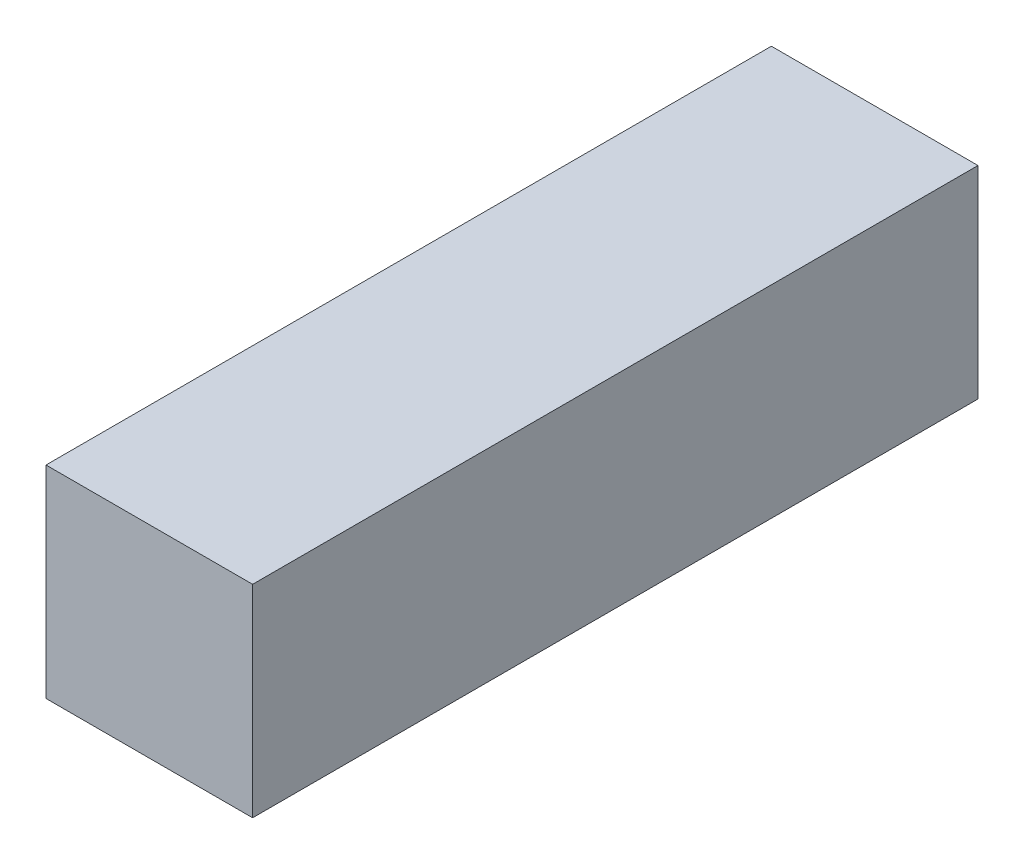
ISO-10303-21;
HEADER;
FILE_DESCRIPTION(('STEP AP214'),'2;1');
FILE_NAME('part.step','',(''),(''),'','','');
FILE_SCHEMA(('AUTOMOTIVE_DESIGN { 1 0 10303 214 1 1 1 1 }'));
ENDSEC;
DATA;
#1=APPLICATION_CONTEXT('core data for automotive mechanical design processes');
#2=APPLICATION_PROTOCOL_DEFINITION('international standard','automotive_design',2000,#1);
#3=PRODUCT_CONTEXT('',#1,'mechanical');
#4=PRODUCT('Part','Part','',(#3));
#5=PRODUCT_RELATED_PRODUCT_CATEGORY('part','',(#4));
#6=PRODUCT_DEFINITION_FORMATION('','',#4);
#7=PRODUCT_DEFINITION_CONTEXT('part definition',#1,'design');
#8=PRODUCT_DEFINITION('design','',#6,#7);
#9=PRODUCT_DEFINITION_SHAPE('','',#8);
#10=(LENGTH_UNIT() NAMED_UNIT(*) SI_UNIT(.MILLI.,.METRE.));
#11=(NAMED_UNIT(*) PLANE_ANGLE_UNIT() SI_UNIT($,.RADIAN.));
#12=(NAMED_UNIT(*) SI_UNIT($,.STERADIAN.) SOLID_ANGLE_UNIT());
#13=UNCERTAINTY_MEASURE_WITH_UNIT(LENGTH_MEASURE(1.E-05),#10,'distance_accuracy_value','');
#14=(GEOMETRIC_REPRESENTATION_CONTEXT(3) GLOBAL_UNCERTAINTY_ASSIGNED_CONTEXT((#13)) GLOBAL_UNIT_ASSIGNED_CONTEXT((#10,
#11,#12)) REPRESENTATION_CONTEXT('',''));
#15=CARTESIAN_POINT('',(0.,0.,0.));
#16=DIRECTION('',(0.,0.,1.));
#17=DIRECTION('',(1.,0.,0.));
#18=AXIS2_PLACEMENT_3D('',#15,#16,#17);
#19=CARTESIAN_POINT('',(23.5,46.,82.5));
#20=DIRECTION('',(-1.,0.,0.));
#21=DIRECTION('',(0.,0.,1.));
#22=AXIS2_PLACEMENT_3D('',#19,#20,#21);
#23=PLANE('',#22);
#24=DIRECTION('',(0.,0.,-1.));
#25=VECTOR('',#24,1.);
#26=CARTESIAN_POINT('',(23.5,0.,82.5));
#27=LINE('',#26,#25);
#28=CARTESIAN_POINT('',(23.5,0.,82.5));
#29=VERTEX_POINT('',#28);
#30=CARTESIAN_POINT('',(23.5,0.,-82.5));
#31=VERTEX_POINT('',#30);
#32=EDGE_CURVE('E100',#29,#31,#27,.T.);
#33=ORIENTED_EDGE('',*,*,#32,.T.);
#34=DIRECTION('',(0.,-1.,0.));
#35=VECTOR('',#34,1.);
#36=CARTESIAN_POINT('',(23.5,46.,-82.5));
#37=LINE('',#36,#35);
#38=CARTESIAN_POINT('',(23.5,46.,-82.5));
#39=VERTEX_POINT('',#38);
#40=EDGE_CURVE('E11',#39,#31,#37,.T.);
#41=ORIENTED_EDGE('',*,*,#40,.F.);
#42=DIRECTION('',(0.,0.,-1.));
#43=VECTOR('',#42,1.);
#44=CARTESIAN_POINT('',(23.5,46.,82.5));
#45=LINE('',#44,#43);
#46=CARTESIAN_POINT('',(23.5,46.,82.5));
#47=VERTEX_POINT('',#46);
#48=EDGE_CURVE('E88',#47,#39,#45,.T.);
#49=ORIENTED_EDGE('',*,*,#48,.F.);
#50=DIRECTION('',(0.,-1.,0.));
#51=VECTOR('',#50,1.);
#52=CARTESIAN_POINT('',(23.5,46.,82.5));
#53=LINE('',#52,#51);
#54=EDGE_CURVE('E96',#47,#29,#53,.T.);
#55=ORIENTED_EDGE('',*,*,#54,.T.);
#56=EDGE_LOOP('',(#33,#41,#49,#55));
#57=FACE_BOUND('',#56,.T.);
#58=ADVANCED_FACE('F37',(#57),#23,.F.);
#59=CARTESIAN_POINT('',(-23.5,46.,-82.5));
#60=DIRECTION('',(0.,0.,1.));
#61=DIRECTION('',(1.,0.,0.));
#62=AXIS2_PLACEMENT_3D('',#59,#60,#61);
#63=PLANE('',#62);
#64=DIRECTION('',(-1.,0.,0.));
#65=VECTOR('',#64,1.);
#66=CARTESIAN_POINT('',(-23.5,0.,-82.5));
#67=LINE('',#66,#65);
#68=CARTESIAN_POINT('',(-23.5,0.,-82.5));
#69=VERTEX_POINT('',#68);
#70=EDGE_CURVE('E92',#31,#69,#67,.T.);
#71=ORIENTED_EDGE('',*,*,#70,.T.);
#72=DIRECTION('',(0.,-1.,0.));
#73=VECTOR('',#72,1.);
#74=CARTESIAN_POINT('',(-23.5,46.,-82.5));
#75=LINE('',#74,#73);
#76=CARTESIAN_POINT('',(-23.5,46.,-82.5));
#77=VERTEX_POINT('',#76);
#78=EDGE_CURVE('E45',#77,#69,#75,.T.);
#79=ORIENTED_EDGE('',*,*,#78,.F.);
#80=DIRECTION('',(-1.,0.,0.));
#81=VECTOR('',#80,1.);
#82=CARTESIAN_POINT('',(-23.5,46.,-82.5));
#83=LINE('',#82,#81);
#84=EDGE_CURVE('E83',#39,#77,#83,.T.);
#85=ORIENTED_EDGE('',*,*,#84,.F.);
#86=ORIENTED_EDGE('',*,*,#40,.T.);
#87=EDGE_LOOP('',(#71,#79,#85,#86));
#88=FACE_BOUND('',#87,.T.);
#89=ADVANCED_FACE('F91',(#88),#63,.F.);
#90=CARTESIAN_POINT('',(-23.5,46.,82.5));
#91=DIRECTION('',(1.,0.,0.));
#92=DIRECTION('',(0.,0.,-1.));
#93=AXIS2_PLACEMENT_3D('',#90,#91,#92);
#94=PLANE('',#93);
#95=DIRECTION('',(0.,0.,1.));
#96=VECTOR('',#95,1.);
#97=CARTESIAN_POINT('',(-23.5,0.,82.5));
#98=LINE('',#97,#96);
#99=CARTESIAN_POINT('',(-23.5,0.,82.5));
#100=VERTEX_POINT('',#99);
#101=EDGE_CURVE('E70',#69,#100,#98,.T.);
#102=ORIENTED_EDGE('',*,*,#101,.T.);
#103=DIRECTION('',(0.,-1.,0.));
#104=VECTOR('',#103,1.);
#105=CARTESIAN_POINT('',(-23.5,46.,82.5));
#106=LINE('',#105,#104);
#107=CARTESIAN_POINT('',(-23.5,46.,82.5));
#108=VERTEX_POINT('',#107);
#109=EDGE_CURVE('E93',#108,#100,#106,.T.);
#110=ORIENTED_EDGE('',*,*,#109,.F.);
#111=DIRECTION('',(0.,0.,1.));
#112=VECTOR('',#111,1.);
#113=CARTESIAN_POINT('',(-23.5,46.,82.5));
#114=LINE('',#113,#112);
#115=EDGE_CURVE('E86',#77,#108,#114,.T.);
#116=ORIENTED_EDGE('',*,*,#115,.F.);
#117=ORIENTED_EDGE('',*,*,#78,.T.);
#118=EDGE_LOOP('',(#102,#110,#116,#117));
#119=FACE_BOUND('',#118,.T.);
#120=ADVANCED_FACE('F94',(#119),#94,.F.);
#121=CARTESIAN_POINT('',(-23.5,46.,82.5));
#122=DIRECTION('',(0.,0.,-1.));
#123=DIRECTION('',(-1.,0.,0.));
#124=AXIS2_PLACEMENT_3D('',#121,#122,#123);
#125=PLANE('',#124);
#126=DIRECTION('',(1.,0.,0.));
#127=VECTOR('',#126,1.);
#128=CARTESIAN_POINT('',(-23.5,0.,82.5));
#129=LINE('',#128,#127);
#130=EDGE_CURVE('E76',#100,#29,#129,.T.);
#131=ORIENTED_EDGE('',*,*,#130,.T.);
#132=ORIENTED_EDGE('',*,*,#54,.F.);
#133=DIRECTION('',(1.,0.,0.));
#134=VECTOR('',#133,1.);
#135=CARTESIAN_POINT('',(-23.5,46.,82.5));
#136=LINE('',#135,#134);
#137=EDGE_CURVE('E53',#108,#47,#136,.T.);
#138=ORIENTED_EDGE('',*,*,#137,.F.);
#139=ORIENTED_EDGE('',*,*,#109,.T.);
#140=EDGE_LOOP('',(#131,#132,#138,#139));
#141=FACE_BOUND('',#140,.T.);
#142=ADVANCED_FACE('F107',(#141),#125,.F.);
#143=CARTESIAN_POINT('',(0.,46.,0.));
#144=DIRECTION('',(0.,-1.,0.));
#145=DIRECTION('',(0.,0.,-1.));
#146=AXIS2_PLACEMENT_3D('',#143,#144,#145);
#147=PLANE('',#146);
#148=ORIENTED_EDGE('',*,*,#48,.T.);
#149=ORIENTED_EDGE('',*,*,#84,.T.);
#150=ORIENTED_EDGE('',*,*,#115,.T.);
#151=ORIENTED_EDGE('',*,*,#137,.T.);
#152=EDGE_LOOP('',(#148,#149,#150,#151));
#153=FACE_BOUND('',#152,.T.);
#154=ADVANCED_FACE('F84',(#153),#147,.F.);
#155=CARTESIAN_POINT('',(0.,0.,0.));
#156=DIRECTION('',(0.,-1.,0.));
#157=DIRECTION('',(0.,0.,-1.));
#158=AXIS2_PLACEMENT_3D('',#155,#156,#157);
#159=PLANE('',#158);
#160=ORIENTED_EDGE('',*,*,#32,.F.);
#161=ORIENTED_EDGE('',*,*,#130,.F.);
#162=ORIENTED_EDGE('',*,*,#101,.F.);
#163=ORIENTED_EDGE('',*,*,#70,.F.);
#164=EDGE_LOOP('',(#160,#161,#162,#163));
#165=FACE_BOUND('',#164,.T.);
#166=ADVANCED_FACE('F110',(#165),#159,.T.);
#167=CLOSED_SHELL('',(#58,#89,#120,#142,#154,#166));
#168=MANIFOLD_SOLID_BREP('B2',#167);
#169=ADVANCED_BREP_SHAPE_REPRESENTATION('',(#18,#168),#14);
#170=SHAPE_DEFINITION_REPRESENTATION(#9,#169);
ENDSEC;
END-ISO-10303-21;
